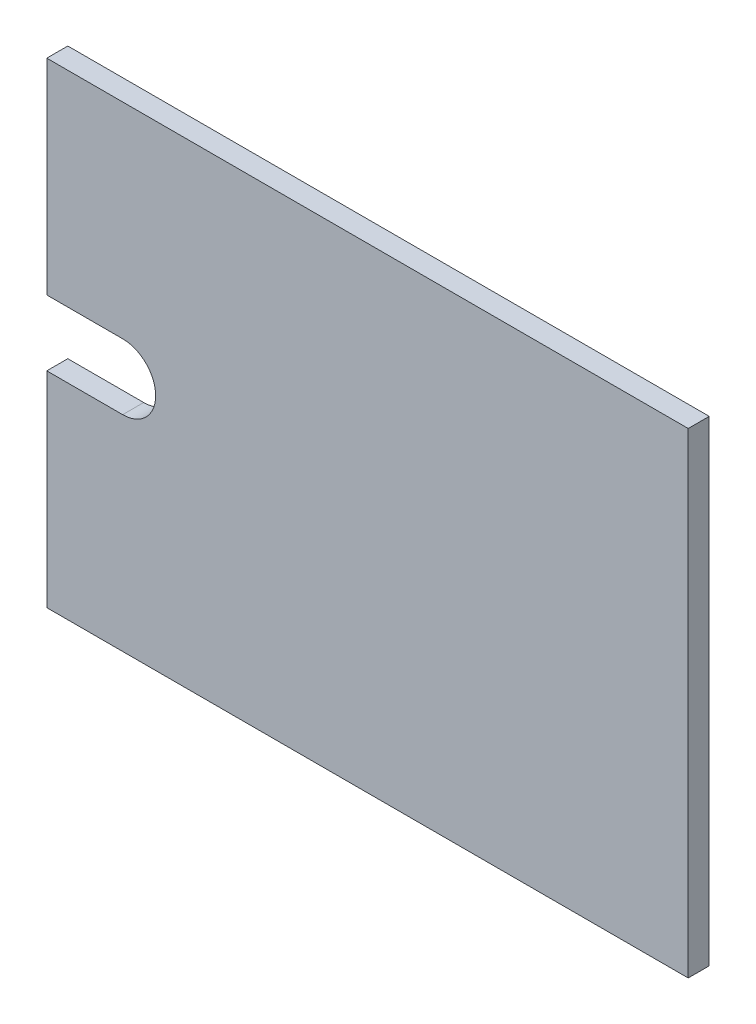
ISO-10303-21;
HEADER;
FILE_DESCRIPTION(('STEP AP214'),'2;1');
FILE_NAME('part.step','',(''),(''),'','','');
FILE_SCHEMA(('AUTOMOTIVE_DESIGN { 1 0 10303 214 1 1 1 1 }'));
ENDSEC;
DATA;
#1=APPLICATION_CONTEXT('core data for automotive mechanical design processes');
#2=APPLICATION_PROTOCOL_DEFINITION('international standard','automotive_design',2000,#1);
#3=PRODUCT_CONTEXT('',#1,'mechanical');
#4=PRODUCT('Part','Part','',(#3));
#5=PRODUCT_RELATED_PRODUCT_CATEGORY('part','',(#4));
#6=PRODUCT_DEFINITION_FORMATION('','',#4);
#7=PRODUCT_DEFINITION_CONTEXT('part definition',#1,'design');
#8=PRODUCT_DEFINITION('design','',#6,#7);
#9=PRODUCT_DEFINITION_SHAPE('','',#8);
#10=(LENGTH_UNIT() NAMED_UNIT(*) SI_UNIT(.MILLI.,.METRE.));
#11=(NAMED_UNIT(*) PLANE_ANGLE_UNIT() SI_UNIT($,.RADIAN.));
#12=(NAMED_UNIT(*) SI_UNIT($,.STERADIAN.) SOLID_ANGLE_UNIT());
#13=UNCERTAINTY_MEASURE_WITH_UNIT(LENGTH_MEASURE(1.E-05),#10,'distance_accuracy_value','');
#14=(GEOMETRIC_REPRESENTATION_CONTEXT(3) GLOBAL_UNCERTAINTY_ASSIGNED_CONTEXT((#13)) GLOBAL_UNIT_ASSIGNED_CONTEXT((#10,
#11,#12)) REPRESENTATION_CONTEXT('',''));
#15=CARTESIAN_POINT('',(0.,0.,0.));
#16=DIRECTION('',(0.,0.,1.));
#17=DIRECTION('',(1.,0.,0.));
#18=AXIS2_PLACEMENT_3D('',#15,#16,#17);
#19=CARTESIAN_POINT('',(-15.5,11.5,1.016));
#20=DIRECTION('',(1.,0.,0.));
#21=DIRECTION('',(0.,1.,0.));
#22=AXIS2_PLACEMENT_3D('',#19,#20,#21);
#23=PLANE('',#22);
#24=DIRECTION('',(0.,-1.,0.));
#25=VECTOR('',#24,1.);
#26=CARTESIAN_POINT('',(-15.5,11.5,0.));
#27=LINE('',#26,#25);
#28=CARTESIAN_POINT('',(-15.5,11.5,0.));
#29=VERTEX_POINT('',#28);
#30=CARTESIAN_POINT('',(-15.5,1.5875,0.));
#31=VERTEX_POINT('',#30);
#32=EDGE_CURVE('E155',#29,#31,#27,.T.);
#33=ORIENTED_EDGE('',*,*,#32,.T.);
#34=DIRECTION('',(0.,0.,-1.));
#35=VECTOR('',#34,1.);
#36=CARTESIAN_POINT('',(-15.5,1.5875,1.016));
#37=LINE('',#36,#35);
#38=CARTESIAN_POINT('',(-15.5,1.5875,1.016));
#39=VERTEX_POINT('',#38);
#40=EDGE_CURVE('E139',#39,#31,#37,.T.);
#41=ORIENTED_EDGE('',*,*,#40,.F.);
#42=DIRECTION('',(0.,-1.,0.));
#43=VECTOR('',#42,1.);
#44=CARTESIAN_POINT('',(-15.5,11.5,1.016));
#45=LINE('',#44,#43);
#46=CARTESIAN_POINT('',(-15.5,11.5,1.016));
#47=VERTEX_POINT('',#46);
#48=EDGE_CURVE('E146',#47,#39,#45,.T.);
#49=ORIENTED_EDGE('',*,*,#48,.F.);
#50=DIRECTION('',(0.,0.,-1.));
#51=VECTOR('',#50,1.);
#52=CARTESIAN_POINT('',(-15.5,11.5,1.016));
#53=LINE('',#52,#51);
#54=EDGE_CURVE('E44',#47,#29,#53,.T.);
#55=ORIENTED_EDGE('',*,*,#54,.T.);
#56=EDGE_LOOP('',(#33,#41,#49,#55));
#57=FACE_BOUND('',#56,.T.);
#58=ADVANCED_FACE('F36',(#57),#23,.F.);
#59=CARTESIAN_POINT('',(15.5,11.5,1.016));
#60=DIRECTION('',(-1.,0.,0.));
#61=DIRECTION('',(0.,-1.,0.));
#62=AXIS2_PLACEMENT_3D('',#59,#60,#61);
#63=PLANE('',#62);
#64=DIRECTION('',(0.,1.,0.));
#65=VECTOR('',#64,1.);
#66=CARTESIAN_POINT('',(15.5,11.5,0.));
#67=LINE('',#66,#65);
#68=CARTESIAN_POINT('',(15.5,-11.5,0.));
#69=VERTEX_POINT('',#68);
#70=CARTESIAN_POINT('',(15.5,11.5,0.));
#71=VERTEX_POINT('',#70);
#72=EDGE_CURVE('E138',#69,#71,#67,.T.);
#73=ORIENTED_EDGE('',*,*,#72,.T.);
#74=DIRECTION('',(0.,0.,-1.));
#75=VECTOR('',#74,1.);
#76=CARTESIAN_POINT('',(15.5,11.5,1.016));
#77=LINE('',#76,#75);
#78=CARTESIAN_POINT('',(15.5,11.5,1.016));
#79=VERTEX_POINT('',#78);
#80=EDGE_CURVE('E11',#79,#71,#77,.T.);
#81=ORIENTED_EDGE('',*,*,#80,.F.);
#82=DIRECTION('',(0.,1.,0.));
#83=VECTOR('',#82,1.);
#84=CARTESIAN_POINT('',(15.5,11.5,1.016));
#85=LINE('',#84,#83);
#86=CARTESIAN_POINT('',(15.5,-11.5,1.016));
#87=VERTEX_POINT('',#86);
#88=EDGE_CURVE('E142',#87,#79,#85,.T.);
#89=ORIENTED_EDGE('',*,*,#88,.F.);
#90=DIRECTION('',(0.,0.,-1.));
#91=VECTOR('',#90,1.);
#92=CARTESIAN_POINT('',(15.5,-11.5,1.016));
#93=LINE('',#92,#91);
#94=EDGE_CURVE('E149',#87,#69,#93,.T.);
#95=ORIENTED_EDGE('',*,*,#94,.T.);
#96=EDGE_LOOP('',(#73,#81,#89,#95));
#97=FACE_BOUND('',#96,.T.);
#98=ADVANCED_FACE('F38',(#97),#63,.F.);
#99=CARTESIAN_POINT('',(-15.5,11.5,1.016));
#100=DIRECTION('',(0.,-1.,0.));
#101=DIRECTION('',(0.,0.,-1.));
#102=AXIS2_PLACEMENT_3D('',#99,#100,#101);
#103=PLANE('',#102);
#104=DIRECTION('',(-1.,0.,0.));
#105=VECTOR('',#104,1.);
#106=CARTESIAN_POINT('',(-15.5,11.5,0.));
#107=LINE('',#106,#105);
#108=EDGE_CURVE('E152',#71,#29,#107,.T.);
#109=ORIENTED_EDGE('',*,*,#108,.T.);
#110=ORIENTED_EDGE('',*,*,#54,.F.);
#111=DIRECTION('',(-1.,0.,0.));
#112=VECTOR('',#111,1.);
#113=CARTESIAN_POINT('',(-15.5,11.5,1.016));
#114=LINE('',#113,#112);
#115=EDGE_CURVE('E88',#79,#47,#114,.T.);
#116=ORIENTED_EDGE('',*,*,#115,.F.);
#117=ORIENTED_EDGE('',*,*,#80,.T.);
#118=EDGE_LOOP('',(#109,#110,#116,#117));
#119=FACE_BOUND('',#118,.T.);
#120=ADVANCED_FACE('F175',(#119),#103,.F.);
#121=CARTESIAN_POINT('',(-15.5,-1.58749999999963,1.016));
#122=VERTEX_POINT('',#121);
#123=CARTESIAN_POINT('',(-15.5,-11.5,1.016));
#124=VERTEX_POINT('',#123);
#125=EDGE_CURVE('E145',#122,#124,#45,.T.);
#126=ORIENTED_EDGE('',*,*,#125,.F.);
#127=DIRECTION('',(0.,0.,-1.));
#128=VECTOR('',#127,1.);
#129=CARTESIAN_POINT('',(-15.5,-1.58749999999963,1.016));
#130=LINE('',#129,#128);
#131=CARTESIAN_POINT('',(-15.5,-1.58749999999963,0.));
#132=VERTEX_POINT('',#131);
#133=EDGE_CURVE('E116',#122,#132,#130,.T.);
#134=ORIENTED_EDGE('',*,*,#133,.T.);
#135=CARTESIAN_POINT('',(-15.5,-11.5,0.));
#136=VERTEX_POINT('',#135);
#137=EDGE_CURVE('E154',#132,#136,#27,.T.);
#138=ORIENTED_EDGE('',*,*,#137,.T.);
#139=DIRECTION('',(0.,0.,-1.));
#140=VECTOR('',#139,1.);
#141=CARTESIAN_POINT('',(-15.5,-11.5,1.016));
#142=LINE('',#141,#140);
#143=EDGE_CURVE('E160',#124,#136,#142,.T.);
#144=ORIENTED_EDGE('',*,*,#143,.F.);
#145=EDGE_LOOP('',(#126,#134,#138,#144));
#146=FACE_BOUND('',#145,.T.);
#147=ADVANCED_FACE('F177',(#146),#23,.F.);
#148=CARTESIAN_POINT('',(-15.5,-11.5,1.016));
#149=DIRECTION('',(0.,1.,0.));
#150=DIRECTION('',(0.,0.,1.));
#151=AXIS2_PLACEMENT_3D('',#148,#149,#150);
#152=PLANE('',#151);
#153=DIRECTION('',(1.,0.,0.));
#154=VECTOR('',#153,1.);
#155=CARTESIAN_POINT('',(-15.5,-11.5,0.));
#156=LINE('',#155,#154);
#157=EDGE_CURVE('E81',#136,#69,#156,.T.);
#158=ORIENTED_EDGE('',*,*,#157,.T.);
#159=ORIENTED_EDGE('',*,*,#94,.F.);
#160=DIRECTION('',(1.,0.,0.));
#161=VECTOR('',#160,1.);
#162=CARTESIAN_POINT('',(-15.5,-11.5,1.016));
#163=LINE('',#162,#161);
#164=EDGE_CURVE('E60',#124,#87,#163,.T.);
#165=ORIENTED_EDGE('',*,*,#164,.F.);
#166=ORIENTED_EDGE('',*,*,#143,.T.);
#167=EDGE_LOOP('',(#158,#159,#165,#166));
#168=FACE_BOUND('',#167,.T.);
#169=ADVANCED_FACE('F182',(#168),#152,.F.);
#170=CARTESIAN_POINT('',(0.,0.,1.016));
#171=DIRECTION('',(0.,0.,1.));
#172=DIRECTION('',(1.,0.,0.));
#173=AXIS2_PLACEMENT_3D('',#170,#171,#172);
#174=PLANE('',#173);
#175=DIRECTION('',(1.,0.,0.));
#176=VECTOR('',#175,1.);
#177=CARTESIAN_POINT('',(-11.825,1.5875,1.016));
#178=LINE('',#177,#176);
#179=CARTESIAN_POINT('',(-11.825,1.5875,1.016));
#180=VERTEX_POINT('',#179);
#181=EDGE_CURVE('E117',#39,#180,#178,.T.);
#182=ORIENTED_EDGE('',*,*,#181,.T.);
#183=CARTESIAN_POINT('',(-11.825,0.,1.016));
#184=DIRECTION('',(0.,0.,-1.));
#185=DIRECTION('',(-1.,0.,0.));
#186=AXIS2_PLACEMENT_3D('',#183,#184,#185);
#187=CIRCLE('',#186,1.5875);
#188=CARTESIAN_POINT('',(-11.8312967812568,-1.58748751193381,1.016));
#189=VERTEX_POINT('',#188);
#190=EDGE_CURVE('E112',#180,#189,#187,.T.);
#191=ORIENTED_EDGE('',*,*,#190,.T.);
#192=DIRECTION('',(-0.999999999994207,-3.40394550047222E-06,0.));
#193=VECTOR('',#192,1.);
#194=CARTESIAN_POINT('',(-11.8312967812568,-1.58748751193381,1.016));
#195=LINE('',#194,#193);
#196=EDGE_CURVE('E120',#189,#122,#195,.T.);
#197=ORIENTED_EDGE('',*,*,#196,.T.);
#198=ORIENTED_EDGE('',*,*,#125,.T.);
#199=ORIENTED_EDGE('',*,*,#164,.T.);
#200=ORIENTED_EDGE('',*,*,#88,.T.);
#201=ORIENTED_EDGE('',*,*,#115,.T.);
#202=ORIENTED_EDGE('',*,*,#48,.T.);
#203=EDGE_LOOP('',(#182,#191,#197,#198,#199,#200,#201,#202));
#204=FACE_BOUND('',#203,.T.);
#205=ADVANCED_FACE('F125',(#204),#174,.T.);
#206=CARTESIAN_POINT('',(0.,0.,0.));
#207=DIRECTION('',(0.,0.,1.));
#208=DIRECTION('',(1.,0.,0.));
#209=AXIS2_PLACEMENT_3D('',#206,#207,#208);
#210=PLANE('',#209);
#211=CARTESIAN_POINT('',(-11.825,0.,0.));
#212=DIRECTION('',(0.,0.,-1.));
#213=DIRECTION('',(-1.,0.,0.));
#214=AXIS2_PLACEMENT_3D('',#211,#212,#213);
#215=CIRCLE('',#214,1.5875);
#216=CARTESIAN_POINT('',(-11.825,1.5875,0.));
#217=VERTEX_POINT('',#216);
#218=CARTESIAN_POINT('',(-11.8312967812568,-1.58748751193381,0.));
#219=VERTEX_POINT('',#218);
#220=EDGE_CURVE('E51',#217,#219,#215,.T.);
#221=ORIENTED_EDGE('',*,*,#220,.F.);
#222=DIRECTION('',(1.,0.,0.));
#223=VECTOR('',#222,1.);
#224=CARTESIAN_POINT('',(-11.825,1.5875,0.));
#225=LINE('',#224,#223);
#226=EDGE_CURVE('E127',#31,#217,#225,.T.);
#227=ORIENTED_EDGE('',*,*,#226,.F.);
#228=ORIENTED_EDGE('',*,*,#32,.F.);
#229=ORIENTED_EDGE('',*,*,#108,.F.);
#230=ORIENTED_EDGE('',*,*,#72,.F.);
#231=ORIENTED_EDGE('',*,*,#157,.F.);
#232=ORIENTED_EDGE('',*,*,#137,.F.);
#233=DIRECTION('',(-0.999999999994207,-3.40394550047222E-06,0.));
#234=VECTOR('',#233,1.);
#235=CARTESIAN_POINT('',(-11.8312967812568,-1.58748751193381,0.));
#236=LINE('',#235,#234);
#237=EDGE_CURVE('E130',#219,#132,#236,.T.);
#238=ORIENTED_EDGE('',*,*,#237,.F.);
#239=EDGE_LOOP('',(#221,#227,#228,#229,#230,#231,#232,#238));
#240=FACE_BOUND('',#239,.T.);
#241=ADVANCED_FACE('F168',(#240),#210,.F.);
#242=CARTESIAN_POINT('',(-11.825,0.,1.016));
#243=DIRECTION('',(0.,0.,-1.));
#244=DIRECTION('',(-1.,0.,0.));
#245=AXIS2_PLACEMENT_3D('',#242,#243,#244);
#246=CYLINDRICAL_SURFACE('',#245,1.5875);
#247=ORIENTED_EDGE('',*,*,#220,.T.);
#248=DIRECTION('',(0.,0.,-1.));
#249=VECTOR('',#248,1.);
#250=CARTESIAN_POINT('',(-11.8312967812568,-1.58748751193381,1.016));
#251=LINE('',#250,#249);
#252=EDGE_CURVE('E108',#189,#219,#251,.T.);
#253=ORIENTED_EDGE('',*,*,#252,.F.);
#254=ORIENTED_EDGE('',*,*,#190,.F.);
#255=DIRECTION('',(0.,0.,-1.));
#256=VECTOR('',#255,1.);
#257=CARTESIAN_POINT('',(-11.825,1.5875,1.016));
#258=LINE('',#257,#256);
#259=EDGE_CURVE('E136',#180,#217,#258,.T.);
#260=ORIENTED_EDGE('',*,*,#259,.T.);
#261=EDGE_LOOP('',(#247,#253,#254,#260));
#262=FACE_BOUND('',#261,.T.);
#263=ADVANCED_FACE('F110',(#262),#246,.F.);
#264=CARTESIAN_POINT('',(-11.825,1.5875,1.016));
#265=DIRECTION('',(0.,1.,0.));
#266=DIRECTION('',(-1.,0.,0.));
#267=AXIS2_PLACEMENT_3D('',#264,#265,#266);
#268=PLANE('',#267);
#269=ORIENTED_EDGE('',*,*,#226,.T.);
#270=ORIENTED_EDGE('',*,*,#259,.F.);
#271=ORIENTED_EDGE('',*,*,#181,.F.);
#272=ORIENTED_EDGE('',*,*,#40,.T.);
#273=EDGE_LOOP('',(#269,#270,#271,#272));
#274=FACE_BOUND('',#273,.T.);
#275=ADVANCED_FACE('F171',(#274),#268,.F.);
#276=CARTESIAN_POINT('',(-11.8312967812568,-1.58748751193381,1.016));
#277=DIRECTION('',(3.40394550047222E-06,-0.999999999994207,0.));
#278=DIRECTION('',(0.999999999994207,3.40394550047222E-06,0.));
#279=AXIS2_PLACEMENT_3D('',#276,#277,#278);
#280=PLANE('',#279);
#281=ORIENTED_EDGE('',*,*,#237,.T.);
#282=ORIENTED_EDGE('',*,*,#133,.F.);
#283=ORIENTED_EDGE('',*,*,#196,.F.);
#284=ORIENTED_EDGE('',*,*,#252,.T.);
#285=EDGE_LOOP('',(#281,#282,#283,#284));
#286=FACE_BOUND('',#285,.T.);
#287=ADVANCED_FACE('F121',(#286),#280,.F.);
#288=CLOSED_SHELL('',(#58,#98,#120,#147,#169,#205,#241,#263,#275,#287));
#289=MANIFOLD_SOLID_BREP('B2',#288);
#290=ADVANCED_BREP_SHAPE_REPRESENTATION('',(#18,#289),#14);
#291=SHAPE_DEFINITION_REPRESENTATION(#9,#290);
ENDSEC;
END-ISO-10303-21;
